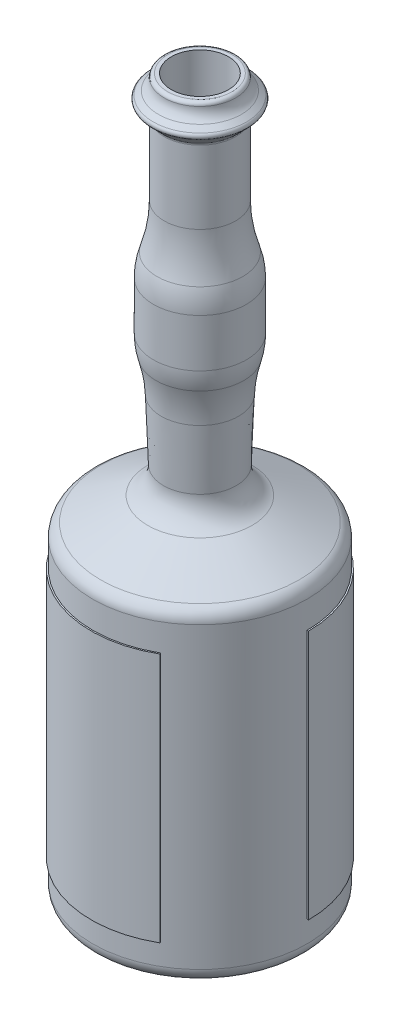
ISO-10303-21;
HEADER;
FILE_DESCRIPTION(('STEP AP214'),'2;1');
FILE_NAME('part.step','',(''),(''),'','','');
FILE_SCHEMA(('AUTOMOTIVE_DESIGN { 1 0 10303 214 1 1 1 1 }'));
ENDSEC;
DATA;
#1=APPLICATION_CONTEXT('core data for automotive mechanical design processes');
#2=APPLICATION_PROTOCOL_DEFINITION('international standard','automotive_design',2000,#1);
#3=PRODUCT_CONTEXT('',#1,'mechanical');
#4=PRODUCT('Part','Part','',(#3));
#5=PRODUCT_RELATED_PRODUCT_CATEGORY('part','',(#4));
#6=PRODUCT_DEFINITION_FORMATION('','',#4);
#7=PRODUCT_DEFINITION_CONTEXT('part definition',#1,'design');
#8=PRODUCT_DEFINITION('design','',#6,#7);
#9=PRODUCT_DEFINITION_SHAPE('','',#8);
#10=(LENGTH_UNIT() NAMED_UNIT(*) SI_UNIT(.MILLI.,.METRE.));
#11=(NAMED_UNIT(*) PLANE_ANGLE_UNIT() SI_UNIT($,.RADIAN.));
#12=(NAMED_UNIT(*) SI_UNIT($,.STERADIAN.) SOLID_ANGLE_UNIT());
#13=UNCERTAINTY_MEASURE_WITH_UNIT(LENGTH_MEASURE(1.E-05),#10,'distance_accuracy_value','');
#14=(GEOMETRIC_REPRESENTATION_CONTEXT(3) GLOBAL_UNCERTAINTY_ASSIGNED_CONTEXT((#13)) GLOBAL_UNIT_ASSIGNED_CONTEXT((#10,
#11,#12)) REPRESENTATION_CONTEXT('',''));
#15=CARTESIAN_POINT('',(0.,0.,0.));
#16=DIRECTION('',(0.,0.,1.));
#17=DIRECTION('',(1.,0.,0.));
#18=AXIS2_PLACEMENT_3D('',#15,#16,#17);
#19=CARTESIAN_POINT('',(0.,0.,0.));
#20=DIRECTION('',(0.,0.,1.));
#21=DIRECTION('',(1.,0.,0.));
#22=AXIS2_PLACEMENT_3D('',#19,#20,#21);
#23=PLANE('',#22);
#24=DIRECTION('',(1.,0.,0.));
#25=VECTOR('',#24,1.);
#26=CARTESIAN_POINT('',(0.,40.,0.));
#27=LINE('',#26,#25);
#28=CARTESIAN_POINT('',(15.,40.,0.));
#29=VERTEX_POINT('',#28);
#30=CARTESIAN_POINT('',(15.2,40.,0.));
#31=VERTEX_POINT('',#30);
#32=EDGE_CURVE('E122',#29,#31,#27,.T.);
#33=ORIENTED_EDGE('',*,*,#32,.F.);
#34=DIRECTION('',(0.,1.,0.));
#35=VECTOR('',#34,1.);
#36=CARTESIAN_POINT('',(15.,0.,0.));
#37=LINE('',#36,#35);
#38=CARTESIAN_POINT('',(15.,5.,0.));
#39=VERTEX_POINT('',#38);
#40=EDGE_CURVE('E132',#39,#29,#37,.T.);
#41=ORIENTED_EDGE('',*,*,#40,.F.);
#42=DIRECTION('',(-1.,0.,0.));
#43=VECTOR('',#42,1.);
#44=CARTESIAN_POINT('',(0.,4.99999999999993,0.));
#45=LINE('',#44,#43);
#46=CARTESIAN_POINT('',(15.2,5.,0.));
#47=VERTEX_POINT('',#46);
#48=EDGE_CURVE('E136',#47,#39,#45,.T.);
#49=ORIENTED_EDGE('',*,*,#48,.F.);
#50=DIRECTION('',(0.,-1.,0.));
#51=VECTOR('',#50,1.);
#52=CARTESIAN_POINT('',(15.2,0.,0.));
#53=LINE('',#52,#51);
#54=EDGE_CURVE('E134',#31,#47,#53,.T.);
#55=ORIENTED_EDGE('',*,*,#54,.F.);
#56=EDGE_LOOP('',(#33,#41,#49,#55));
#57=FACE_BOUND('',#56,.T.);
#58=ADVANCED_FACE('F81',(#57),#23,.T.);
#59=CARTESIAN_POINT('',(0.,0.,0.));
#60=DIRECTION('',(0.,-1.,0.));
#61=DIRECTION('',(0.,0.,-1.));
#62=AXIS2_PLACEMENT_3D('',#59,#60,#61);
#63=CYLINDRICAL_SURFACE('',#62,15.);
#64=CARTESIAN_POINT('',(0.,5.,0.));
#65=DIRECTION('',(0.,-1.,0.));
#66=DIRECTION('',(0.,0.,-1.));
#67=AXIS2_PLACEMENT_3D('',#64,#65,#66);
#68=CIRCLE('',#67,15.);
#69=CARTESIAN_POINT('',(7.50000000000015,5.,12.9903810567665));
#70=VERTEX_POINT('',#69);
#71=EDGE_CURVE('E89',#70,#39,#68,.T.);
#72=ORIENTED_EDGE('',*,*,#71,.T.);
#73=ORIENTED_EDGE('',*,*,#40,.T.);
#74=CARTESIAN_POINT('',(0.,40.,0.));
#75=DIRECTION('',(0.,-1.,0.));
#76=DIRECTION('',(0.,0.,-1.));
#77=AXIS2_PLACEMENT_3D('',#74,#75,#76);
#78=CIRCLE('',#77,15.);
#79=CARTESIAN_POINT('',(7.50000000000015,40.,12.9903810567665));
#80=VERTEX_POINT('',#79);
#81=EDGE_CURVE('E13',#80,#29,#78,.T.);
#82=ORIENTED_EDGE('',*,*,#81,.F.);
#83=DIRECTION('',(0.,1.,0.));
#84=VECTOR('',#83,1.);
#85=CARTESIAN_POINT('',(7.50000000000015,0.,12.9903810567665));
#86=LINE('',#85,#84);
#87=EDGE_CURVE('E142',#70,#80,#86,.T.);
#88=ORIENTED_EDGE('',*,*,#87,.F.);
#89=EDGE_LOOP('',(#72,#73,#82,#88));
#90=FACE_BOUND('',#89,.T.);
#91=ADVANCED_FACE('F83',(#90),#63,.F.);
#92=CARTESIAN_POINT('',(0.,5.,0.));
#93=DIRECTION('',(0.,1.,0.));
#94=DIRECTION('',(0.,0.,1.));
#95=AXIS2_PLACEMENT_3D('',#92,#93,#94);
#96=PLANE('',#95);
#97=CARTESIAN_POINT('',(0.,5.,0.));
#98=DIRECTION('',(0.,-1.,0.));
#99=DIRECTION('',(0.,0.,-1.));
#100=AXIS2_PLACEMENT_3D('',#97,#98,#99);
#101=CIRCLE('',#100,15.2);
#102=CARTESIAN_POINT('',(7.60000000000016,5.,13.1635861375234));
#103=VERTEX_POINT('',#102);
#104=EDGE_CURVE('E104',#103,#47,#101,.T.);
#105=ORIENTED_EDGE('',*,*,#104,.T.);
#106=ORIENTED_EDGE('',*,*,#48,.T.);
#107=ORIENTED_EDGE('',*,*,#71,.F.);
#108=DIRECTION('',(-0.50000000000001,0.,-0.866025403784433));
#109=VECTOR('',#108,1.);
#110=CARTESIAN_POINT('',(0.,4.99999999999993,0.));
#111=LINE('',#110,#109);
#112=EDGE_CURVE('E144',#103,#70,#111,.T.);
#113=ORIENTED_EDGE('',*,*,#112,.F.);
#114=EDGE_LOOP('',(#105,#106,#107,#113));
#115=FACE_BOUND('',#114,.T.);
#116=ADVANCED_FACE('F152',(#115),#96,.F.);
#117=CARTESIAN_POINT('',(0.,0.,0.));
#118=DIRECTION('',(0.,-1.,0.));
#119=DIRECTION('',(0.,0.,-1.));
#120=AXIS2_PLACEMENT_3D('',#117,#118,#119);
#121=CYLINDRICAL_SURFACE('',#120,15.2);
#122=DIRECTION('',(0.,-1.,0.));
#123=VECTOR('',#122,1.);
#124=CARTESIAN_POINT('',(7.60000000000016,0.,13.1635861375234));
#125=LINE('',#124,#123);
#126=CARTESIAN_POINT('',(7.60000000000015,40.,13.1635861375234));
#127=VERTEX_POINT('',#126);
#128=EDGE_CURVE('E147',#127,#103,#125,.T.);
#129=ORIENTED_EDGE('',*,*,#128,.F.);
#130=CARTESIAN_POINT('',(0.,40.,0.));
#131=DIRECTION('',(0.,-1.,0.));
#132=DIRECTION('',(0.,0.,-1.));
#133=AXIS2_PLACEMENT_3D('',#130,#131,#132);
#134=CIRCLE('',#133,15.2);
#135=EDGE_CURVE('E96',#127,#31,#134,.T.);
#136=ORIENTED_EDGE('',*,*,#135,.T.);
#137=ORIENTED_EDGE('',*,*,#54,.T.);
#138=ORIENTED_EDGE('',*,*,#104,.F.);
#139=EDGE_LOOP('',(#129,#136,#137,#138));
#140=FACE_BOUND('',#139,.T.);
#141=ADVANCED_FACE('F153',(#140),#121,.T.);
#142=CARTESIAN_POINT('',(0.,40.,0.));
#143=DIRECTION('',(0.,-1.,0.));
#144=DIRECTION('',(0.,0.,-1.));
#145=AXIS2_PLACEMENT_3D('',#142,#143,#144);
#146=PLANE('',#145);
#147=ORIENTED_EDGE('',*,*,#81,.T.);
#148=ORIENTED_EDGE('',*,*,#32,.T.);
#149=ORIENTED_EDGE('',*,*,#135,.F.);
#150=DIRECTION('',(0.50000000000001,0.,0.866025403784433));
#151=VECTOR('',#150,1.);
#152=CARTESIAN_POINT('',(0.,40.,0.));
#153=LINE('',#152,#151);
#154=EDGE_CURVE('E124',#80,#127,#153,.T.);
#155=ORIENTED_EDGE('',*,*,#154,.F.);
#156=EDGE_LOOP('',(#147,#148,#149,#155));
#157=FACE_BOUND('',#156,.T.);
#158=ADVANCED_FACE('F121',(#157),#146,.F.);
#159=CARTESIAN_POINT('',(0.,0.,0.));
#160=DIRECTION('',(-0.866025403784433,0.,0.50000000000001));
#161=DIRECTION('',(0.50000000000001,0.,0.866025403784433));
#162=AXIS2_PLACEMENT_3D('',#159,#160,#161);
#163=PLANE('',#162);
#164=ORIENTED_EDGE('',*,*,#154,.T.);
#165=ORIENTED_EDGE('',*,*,#128,.T.);
#166=ORIENTED_EDGE('',*,*,#112,.T.);
#167=ORIENTED_EDGE('',*,*,#87,.T.);
#168=EDGE_LOOP('',(#164,#165,#166,#167));
#169=FACE_BOUND('',#168,.T.);
#170=ADVANCED_FACE('F155',(#169),#163,.F.);
#171=CLOSED_SHELL('',(#58,#91,#116,#141,#158,#170));
#172=MANIFOLD_SOLID_BREP('B2',#171);
#173=CARTESIAN_POINT('',(0.,0.,0.));
#174=DIRECTION('',(0.,1.,0.));
#175=DIRECTION('',(0.,0.,1.));
#176=AXIS2_PLACEMENT_3D('',#173,#174,#175);
#177=PLANE('',#176);
#178=CARTESIAN_POINT('',(0.,0.,0.));
#179=DIRECTION('',(0.,1.,0.));
#180=DIRECTION('',(0.,0.,1.));
#181=AXIS2_PLACEMENT_3D('',#178,#179,#180);
#182=CIRCLE('',#181,13.);
#183=CARTESIAN_POINT('',(0.,0.,13.));
#184=VERTEX_POINT('',#183);
#185=EDGE_CURVE('E376',#184,#184,#182,.F.);
#186=ORIENTED_EDGE('',*,*,#185,.T.);
#187=EDGE_LOOP('',(#186));
#188=FACE_BOUND('',#187,.T.);
#189=ADVANCED_FACE('F247',(#188),#177,.F.);
#190=CARTESIAN_POINT('',(0.,0.,0.));
#191=DIRECTION('',(0.,1.,0.));
#192=DIRECTION('',(0.,0.,1.));
#193=AXIS2_PLACEMENT_3D('',#190,#191,#192);
#194=CYLINDRICAL_SURFACE('',#193,15.);
#195=CARTESIAN_POINT('',(0.,43.7639320225002,0.));
#196=DIRECTION('',(0.,-1.,0.));
#197=DIRECTION('',(0.,0.,-1.));
#198=AXIS2_PLACEMENT_3D('',#195,#196,#197);
#199=CIRCLE('',#198,15.);
#200=CARTESIAN_POINT('',(0.,43.7639320225002,-15.));
#201=VERTEX_POINT('',#200);
#202=EDGE_CURVE('E380',#201,#201,#199,.T.);
#203=ORIENTED_EDGE('',*,*,#202,.T.);
#204=EDGE_LOOP('',(#203));
#205=FACE_BOUND('',#204,.T.);
#206=CARTESIAN_POINT('',(0.,2.,0.));
#207=DIRECTION('',(0.,1.,0.));
#208=DIRECTION('',(0.,0.,1.));
#209=AXIS2_PLACEMENT_3D('',#206,#207,#208);
#210=CIRCLE('',#209,15.);
#211=CARTESIAN_POINT('',(0.,2.,15.));
#212=VERTEX_POINT('',#211);
#213=EDGE_CURVE('E415',#212,#212,#210,.T.);
#214=ORIENTED_EDGE('',*,*,#213,.T.);
#215=EDGE_LOOP('',(#214));
#216=FACE_BOUND('',#215,.T.);
#217=ADVANCED_FACE('F337',(#205,#216),#194,.T.);
#218=CARTESIAN_POINT('',(0.,50.,0.));
#219=DIRECTION('',(0.,-1.,0.));
#220=DIRECTION('',(0.,0.,-1.));
#221=AXIS2_PLACEMENT_3D('',#218,#219,#220);
#222=CONICAL_SURFACE('',#221,5.,1.10714871779409);
#223=CARTESIAN_POINT('',(0.,48.8498036512811,0.));
#224=DIRECTION('',(0.,-1.,0.));
#225=DIRECTION('',(0.,0.,-1.));
#226=AXIS2_PLACEMENT_3D('',#223,#224,#225);
#227=CIRCLE('',#226,7.30039269743788);
#228=CARTESIAN_POINT('',(0.,48.8498036512811,-7.30039269743788));
#229=VERTEX_POINT('',#228);
#230=EDGE_CURVE('E371',#229,#229,#227,.T.);
#231=ORIENTED_EDGE('',*,*,#230,.T.);
#232=EDGE_LOOP('',(#231));
#233=FACE_BOUND('',#232,.T.);
#234=CARTESIAN_POINT('',(0.,45.5527864045,0.));
#235=DIRECTION('',(0.,1.,0.));
#236=DIRECTION('',(0.,0.,1.));
#237=AXIS2_PLACEMENT_3D('',#234,#235,#236);
#238=CIRCLE('',#237,13.8944271909999);
#239=CARTESIAN_POINT('',(0.,45.5527864045,13.8944271909999));
#240=VERTEX_POINT('',#239);
#241=EDGE_CURVE('E413',#240,#240,#238,.T.);
#242=ORIENTED_EDGE('',*,*,#241,.T.);
#243=EDGE_LOOP('',(#242));
#244=FACE_BOUND('',#243,.T.);
#245=ADVANCED_FACE('F343',(#233,#244),#222,.T.);
#246=CARTESIAN_POINT('',(0.,50.,0.));
#247=DIRECTION('',(0.,1.,0.));
#248=DIRECTION('',(0.,0.,1.));
#249=AXIS2_PLACEMENT_3D('',#246,#247,#248);
#250=CONICAL_SURFACE('',#249,5.,0.0356991126793239);
#251=CARTESIAN_POINT('',(0.,61.1216545078617,0.));
#252=DIRECTION('',(0.,1.,0.));
#253=DIRECTION('',(0.,0.,1.));
#254=AXIS2_PLACEMENT_3D('',#251,#252,#253);
#255=CIRCLE('',#254,5.39720194670935);
#256=CARTESIAN_POINT('',(0.,61.1216545078617,5.39720194670935));
#257=VERTEX_POINT('',#256);
#258=EDGE_CURVE('E378',#257,#257,#255,.F.);
#259=ORIENTED_EDGE('',*,*,#258,.T.);
#260=EDGE_LOOP('',(#259));
#261=FACE_BOUND('',#260,.T.);
#262=CARTESIAN_POINT('',(0.,52.5702785373304,0.));
#263=DIRECTION('',(0.,1.,0.));
#264=DIRECTION('',(0.,0.,1.));
#265=AXIS2_PLACEMENT_3D('',#262,#263,#264);
#266=CIRCLE('',#265,5.09179566204751);
#267=CARTESIAN_POINT('',(0.,52.5702785373304,5.09179566204751));
#268=VERTEX_POINT('',#267);
#269=EDGE_CURVE('E374',#268,#268,#266,.T.);
#270=ORIENTED_EDGE('',*,*,#269,.T.);
#271=EDGE_LOOP('',(#270));
#272=FACE_BOUND('',#271,.T.);
#273=ADVANCED_FACE('F354',(#261,#272),#250,.T.);
#274=CARTESIAN_POINT('',(0.,43.7639320225002,0.));
#275=DIRECTION('',(0.,-1.,0.));
#276=DIRECTION('',(0.,0.,-1.));
#277=AXIS2_PLACEMENT_3D('',#274,#275,#276);
#278=TOROIDAL_SURFACE('',#277,13.,2.);
#279=ORIENTED_EDGE('',*,*,#202,.F.);
#280=EDGE_LOOP('',(#279));
#281=FACE_BOUND('',#280,.T.);
#282=ORIENTED_EDGE('',*,*,#241,.F.);
#283=EDGE_LOOP('',(#282));
#284=FACE_BOUND('',#283,.T.);
#285=ADVANCED_FACE('F350',(#281,#284),#278,.T.);
#286=CARTESIAN_POINT('',(0.,2.,0.));
#287=DIRECTION('',(0.,1.,0.));
#288=DIRECTION('',(0.,0.,1.));
#289=AXIS2_PLACEMENT_3D('',#286,#287,#288);
#290=TOROIDAL_SURFACE('',#289,13.,2.);
#291=ORIENTED_EDGE('',*,*,#185,.F.);
#292=EDGE_LOOP('',(#291));
#293=FACE_BOUND('',#292,.T.);
#294=ORIENTED_EDGE('',*,*,#213,.F.);
#295=EDGE_LOOP('',(#294));
#296=FACE_BOUND('',#295,.T.);
#297=ADVANCED_FACE('F353',(#293,#296),#290,.T.);
#298=CARTESIAN_POINT('',(0.,67.,0.));
#299=DIRECTION('',(0.,1.,0.));
#300=DIRECTION('',(0.,0.,1.));
#301=AXIS2_PLACEMENT_3D('',#298,#299,#300);
#302=CYLINDRICAL_SURFACE('',#301,6.5);
#303=CARTESIAN_POINT('',(0.,68.5126389067792,0.));
#304=DIRECTION('',(0.,-1.,0.));
#305=DIRECTION('',(0.,0.,-1.));
#306=AXIS2_PLACEMENT_3D('',#303,#304,#305);
#307=CIRCLE('',#306,6.5);
#308=CARTESIAN_POINT('',(0.,68.5126389067792,-6.5));
#309=VERTEX_POINT('',#308);
#310=EDGE_CURVE('E254',#309,#309,#307,.F.);
#311=ORIENTED_EDGE('',*,*,#310,.T.);
#312=EDGE_LOOP('',(#311));
#313=FACE_BOUND('',#312,.T.);
#314=CARTESIAN_POINT('',(0.,75.2318450791878,0.));
#315=DIRECTION('',(0.,-1.,0.));
#316=DIRECTION('',(0.,0.,-1.));
#317=AXIS2_PLACEMENT_3D('',#314,#315,#316);
#318=CIRCLE('',#317,6.5);
#319=CARTESIAN_POINT('',(0.,75.2318450791878,-6.5));
#320=VERTEX_POINT('',#319);
#321=EDGE_CURVE('E282',#320,#320,#318,.T.);
#322=ORIENTED_EDGE('',*,*,#321,.T.);
#323=EDGE_LOOP('',(#322));
#324=FACE_BOUND('',#323,.T.);
#325=ADVANCED_FACE('F357',(#313,#324),#302,.T.);
#326=CARTESIAN_POINT('',(0.,52.4275124152807,0.));
#327=DIRECTION('',(0.,1.,0.));
#328=DIRECTION('',(0.,0.,1.));
#329=AXIS2_PLACEMENT_3D('',#326,#327,#328);
#330=TOROIDAL_SURFACE('',#329,9.08924707943771,4.);
#331=ORIENTED_EDGE('',*,*,#230,.F.);
#332=EDGE_LOOP('',(#331));
#333=FACE_BOUND('',#332,.T.);
#334=ORIENTED_EDGE('',*,*,#269,.F.);
#335=EDGE_LOOP('',(#334));
#336=FACE_BOUND('',#335,.T.);
#337=ADVANCED_FACE('F359',(#333,#336),#330,.F.);
#338=CARTESIAN_POINT('',(0.,60.4078238976134,0.));
#339=DIRECTION('',(0.,1.,0.));
#340=DIRECTION('',(0.,0.,1.));
#341=AXIS2_PLACEMENT_3D('',#338,#339,#340);
#342=TOROIDAL_SURFACE('',#341,25.3844590336603,20.);
#343=CARTESIAN_POINT('',(0.,65.8110339037239,0.));
#344=DIRECTION('',(0.,-1.,0.));
#345=DIRECTION('',(0.,0.,-1.));
#346=AXIS2_PLACEMENT_3D('',#343,#344,#345);
#347=CIRCLE('',#346,6.12815301122012);
#348=CARTESIAN_POINT('',(0.,65.8110339037239,-6.12815301122012));
#349=VERTEX_POINT('',#348);
#350=EDGE_CURVE('E80',#349,#349,#347,.T.);
#351=ORIENTED_EDGE('',*,*,#350,.T.);
#352=EDGE_LOOP('',(#351));
#353=FACE_BOUND('',#352,.T.);
#354=ORIENTED_EDGE('',*,*,#258,.F.);
#355=EDGE_LOOP('',(#354));
#356=FACE_BOUND('',#355,.T.);
#357=ADVANCED_FACE('F308',(#353,#356),#342,.F.);
#358=CARTESIAN_POINT('',(0.,80.,0.));
#359=DIRECTION('',(0.,1.,0.));
#360=DIRECTION('',(0.,0.,1.));
#361=AXIS2_PLACEMENT_3D('',#358,#359,#360);
#362=CYLINDRICAL_SURFACE('',#361,5.);
#363=CARTESIAN_POINT('',(0.,94.8044922111821,0.));
#364=DIRECTION('',(0.,1.,0.));
#365=DIRECTION('',(0.,0.,1.));
#366=AXIS2_PLACEMENT_3D('',#363,#364,#365);
#367=CIRCLE('',#366,5.);
#368=CARTESIAN_POINT('',(0.,94.8044922111821,5.));
#369=VERTEX_POINT('',#368);
#370=EDGE_CURVE('E262',#369,#369,#367,.F.);
#371=ORIENTED_EDGE('',*,*,#370,.T.);
#372=EDGE_LOOP('',(#371));
#373=FACE_BOUND('',#372,.T.);
#374=CARTESIAN_POINT('',(0.,84.5993420767853,0.));
#375=DIRECTION('',(0.,1.,0.));
#376=DIRECTION('',(0.,0.,1.));
#377=AXIS2_PLACEMENT_3D('',#374,#375,#376);
#378=CIRCLE('',#377,5.);
#379=CARTESIAN_POINT('',(0.,84.5993420767853,5.));
#380=VERTEX_POINT('',#379);
#381=EDGE_CURVE('E288',#380,#380,#378,.T.);
#382=ORIENTED_EDGE('',*,*,#381,.T.);
#383=EDGE_LOOP('',(#382));
#384=FACE_BOUND('',#383,.T.);
#385=ADVANCED_FACE('F306',(#373,#384),#362,.T.);
#386=CARTESIAN_POINT('',(0.,84.5993420767853,0.));
#387=DIRECTION('',(0.,-1.,0.));
#388=DIRECTION('',(0.,0.,-1.));
#389=AXIS2_PLACEMENT_3D('',#386,#387,#388);
#390=TOROIDAL_SURFACE('',#389,25.,20.);
#391=CARTESIAN_POINT('',(0.,78.354344078387,0.));
#392=DIRECTION('',(0.,1.,0.));
#393=DIRECTION('',(0.,0.,1.));
#394=AXIS2_PLACEMENT_3D('',#391,#392,#393);
#395=CIRCLE('',#394,6.);
#396=CARTESIAN_POINT('',(0.,78.354344078387,6.));
#397=VERTEX_POINT('',#396);
#398=EDGE_CURVE('E285',#397,#397,#395,.T.);
#399=ORIENTED_EDGE('',*,*,#398,.T.);
#400=EDGE_LOOP('',(#399));
#401=FACE_BOUND('',#400,.T.);
#402=ORIENTED_EDGE('',*,*,#381,.F.);
#403=EDGE_LOOP('',(#402));
#404=FACE_BOUND('',#403,.T.);
#405=ADVANCED_FACE('F295',(#401,#404),#390,.F.);
#406=CARTESIAN_POINT('',(0.,75.2318450791878,0.));
#407=DIRECTION('',(0.,-1.,0.));
#408=DIRECTION('',(0.,0.,-1.));
#409=AXIS2_PLACEMENT_3D('',#406,#407,#408);
#410=DEGENERATE_TOROIDAL_SURFACE('',#409,3.5,10.,.F.);
#411=ORIENTED_EDGE('',*,*,#321,.F.);
#412=EDGE_LOOP('',(#411));
#413=FACE_BOUND('',#412,.T.);
#414=ORIENTED_EDGE('',*,*,#398,.F.);
#415=EDGE_LOOP('',(#414));
#416=FACE_BOUND('',#415,.T.);
#417=ADVANCED_FACE('F305',(#413,#416),#410,.F.);
#418=CARTESIAN_POINT('',(6.95787828317773,97.,-0.766765802891455));
#419=CARTESIAN_POINT('',(4.96911137244617,95.,0.554916361469131));
#420=CARTESIAN_POINT('',(8.49140988896064,97.,13.148990763464));
#421=CARTESIAN_POINT('',(3.85927864950791,95.,10.4931391063615));
#422=CARTESIAN_POINT('',(-5.42434667739482,97.,14.6825223692469));
#423=CARTESIAN_POINT('',(-6.07894409538443,95.,9.38330638342321));
#424=CARTESIAN_POINT('',(-6.95787828317773,97.,0.766765802891455));
#425=CARTESIAN_POINT('',(-4.96911137244617,95.,-0.554916361469132));
#426=CARTESIAN_POINT('',(-8.49140988896064,97.,-13.148990763464));
#427=CARTESIAN_POINT('',(-3.85927864950791,95.,-10.4931391063615));
#428=CARTESIAN_POINT('',(5.42434667739482,97.,-14.6825223692469));
#429=CARTESIAN_POINT('',(6.07894409538443,95.,-9.38330638342321));
#430=CARTESIAN_POINT('',(6.95787828317773,97.,-0.766765802891455));
#431=CARTESIAN_POINT('',(4.96911137244617,95.,0.554916361469131));
#432=(BOUNDED_SURFACE() B_SPLINE_SURFACE(3,1,((#418,#419),(#420,#421),(#422,#423),(#424,#425),
(#426,#427),(#428,#429),(#430,#431)),.UNSPECIFIED.,.T.,.F.,.F.) B_SPLINE_SURFACE_WITH_KNOTS((4,
3,4),(2,2),(0.,0.5,1.),(0.,1.),
.UNSPECIFIED.) GEOMETRIC_REPRESENTATION_ITEM() RATIONAL_B_SPLINE_SURFACE(((1.,1.),
(0.333333333333333,0.333333333333333),(0.333333333333333,0.333333333333333),(1.,1.),
(0.333333333333333,0.333333333333333),(0.333333333333333,0.333333333333333),(1.,1.))) REPRESENTATION_ITEM('') SURFACE());
#433=CARTESIAN_POINT('',(0.,96.5941117168195,0.));
#434=DIRECTION('',(0.,-1.,0.));
#435=DIRECTION('',(0.,0.,-1.));
#436=AXIS2_PLACEMENT_3D('',#433,#434,#435);
#437=CIRCLE('',#436,6.57320252634436);
#438=CARTESIAN_POINT('',(6.55426968965621,96.5941117168195,-0.498538150590147));
#439=VERTEX_POINT('',#438);
#440=EDGE_CURVE('E267',#439,#439,#437,.T.);
#441=CARTESIAN_POINT('',(0.,95.1452598366395,0.));
#442=DIRECTION('',(0.,-1.,0.));
#443=DIRECTION('',(0.,0.,-1.));
#444=AXIS2_PLACEMENT_3D('',#441,#442,#443);
#445=CIRCLE('',#444,5.13410735804045);
#446=CARTESIAN_POINT('',(5.11355535072966,95.1452598366395,0.458922693826928));
#447=VERTEX_POINT('',#446);
#448=EDGE_CURVE('E270',#447,#447,#445,.F.);
#449=CARTESIAN_POINT('',(6.55426968965621,96.5941117168195,-0.498538150590147));
#450=CARTESIAN_POINT('',(6.53926224862572,96.5790195097343,-0.488564600127468));
#451=CARTESIAN_POINT('',(6.52425480759524,96.5639273026491,-0.478591049664791));
#452=CARTESIAN_POINT('',(6.49423992553427,96.5337428884787,-0.458643948739436));
#453=CARTESIAN_POINT('',(6.47923248450379,96.5186506813935,-0.448670398276759));
#454=CARTESIAN_POINT('',(6.44921760244282,96.488466267223,-0.428723297351402));
#455=CARTESIAN_POINT('',(6.43421016141233,96.4733740601378,-0.418749746888723));
#456=CARTESIAN_POINT('',(6.40419527935136,96.4431896459674,-0.398802645963367));
#457=CARTESIAN_POINT('',(6.38918783832088,96.4280974388822,-0.388829095500691));
#458=CARTESIAN_POINT('',(6.35917295625991,96.3979130247118,-0.368881994575336));
#459=CARTESIAN_POINT('',(6.34416551522942,96.3828208176266,-0.358908444112658));
#460=CARTESIAN_POINT('',(6.31415063316845,96.3526364034562,-0.338961343187301));
#461=CARTESIAN_POINT('',(6.29914319213797,96.337544196371,-0.328987792724623));
#462=CARTESIAN_POINT('',(6.269128310077,96.3073597822005,-0.309040691799267));
#463=CARTESIAN_POINT('',(6.25412086904651,96.2922675751153,-0.29906714133659));
#464=CARTESIAN_POINT('',(6.22410598698554,96.2620831609449,-0.279120040411235));
#465=CARTESIAN_POINT('',(6.20909854595506,96.2469909538597,-0.269146489948556));
#466=CARTESIAN_POINT('',(6.17908366389409,96.2168065396893,-0.2491993890232));
#467=CARTESIAN_POINT('',(6.1640762228636,96.2017143326041,-0.239225838560522));
#468=CARTESIAN_POINT('',(6.13406134080263,96.1715299184337,-0.219278737635168));
#469=CARTESIAN_POINT('',(6.11905389977215,96.1564377113485,-0.20930518717249));
#470=CARTESIAN_POINT('',(6.08903901771118,96.1262532971781,-0.189358086247133));
#471=CARTESIAN_POINT('',(6.07403157668069,96.1111610900928,-0.179384535784454));
#472=CARTESIAN_POINT('',(6.04401669461972,96.0809766759224,-0.159437434859099));
#473=CARTESIAN_POINT('',(6.02900925358924,96.0658844688372,-0.149463884396423));
#474=CARTESIAN_POINT('',(5.99899437152827,96.0357000546668,-0.129516783471067));
#475=CARTESIAN_POINT('',(5.98398693049778,96.0206078475816,-0.119543233008387));
#476=CARTESIAN_POINT('',(5.95397204843681,95.9904234334112,-0.0995961320830312));
#477=CARTESIAN_POINT('',(5.93896460740633,95.975331226326,-0.0896225816203554));
#478=CARTESIAN_POINT('',(5.90894972534536,95.9451468121555,-0.0696754806950009));
#479=CARTESIAN_POINT('',(5.89394228431488,95.9300546050703,-0.0597019302323221));
#480=CARTESIAN_POINT('',(5.8639274022539,95.8998701908999,-0.0397548293069646));
#481=CARTESIAN_POINT('',(5.84891996122342,95.8847779838147,-0.0297812788442858));
#482=CARTESIAN_POINT('',(5.81890507916245,95.8545935696443,-0.00983417791893101));
#483=CARTESIAN_POINT('',(5.80389763813197,95.8395013625591,0.000139372543744924));
#484=CARTESIAN_POINT('',(5.773882756071,95.8093169483887,0.0200864734691004));
#485=CARTESIAN_POINT('',(5.75887531504051,95.7942247413035,0.0300600239317798));
#486=CARTESIAN_POINT('',(5.72886043297954,95.7640403271331,0.0500071248571365));
#487=CARTESIAN_POINT('',(5.71385299194906,95.7489481200478,0.0599806753198136));
#488=CARTESIAN_POINT('',(5.68383810988809,95.7187637058774,0.0799277762451688));
#489=CARTESIAN_POINT('',(5.6688306688576,95.7036714987922,0.0899013267078468));
#490=CARTESIAN_POINT('',(5.63881578679663,95.6734870846218,0.109848427633203));
#491=CARTESIAN_POINT('',(5.62380834576615,95.6583948775366,0.119821978095881));
#492=CARTESIAN_POINT('',(5.59379346370518,95.6282104633662,0.139769079021236));
#493=CARTESIAN_POINT('',(5.57878602267469,95.613118256281,0.149742629483913));
#494=CARTESIAN_POINT('',(5.54877114061372,95.5829338421106,0.169689730409269));
#495=CARTESIAN_POINT('',(5.53376369958324,95.5678416350253,0.179663280871948));
#496=CARTESIAN_POINT('',(5.50374881752227,95.5376572208549,0.199610381797304));
#497=CARTESIAN_POINT('',(5.48874137649178,95.5225650137697,0.209583932259981));
#498=CARTESIAN_POINT('',(5.45872649443081,95.4923805995993,0.229531033185336));
#499=CARTESIAN_POINT('',(5.44371905340033,95.4772883925141,0.239504583648015));
#500=CARTESIAN_POINT('',(5.41370417133936,95.4471039783437,0.259451684573371));
#501=CARTESIAN_POINT('',(5.39869673030887,95.4320117712585,0.269425235036049));
#502=CARTESIAN_POINT('',(5.3686818482479,95.4018273570881,0.289372335961404));
#503=CARTESIAN_POINT('',(5.35367440721742,95.3867351500029,0.299345886424082));
#504=CARTESIAN_POINT('',(5.32365952515645,95.3565507358324,0.319292987349438));
#505=CARTESIAN_POINT('',(5.30865208412597,95.3414585287472,0.329266537812115));
#506=CARTESIAN_POINT('',(5.278637202065,95.3112741145768,0.349213638737471));
#507=CARTESIAN_POINT('',(5.26362976103451,95.2961819074916,0.35918718920015));
#508=CARTESIAN_POINT('',(5.23361487897354,95.2659974933212,0.379134290125506));
#509=CARTESIAN_POINT('',(5.21860743794305,95.250905286236,0.389107840588183));
#510=CARTESIAN_POINT('',(5.18859255588209,95.2207208720656,0.409054941513538));
#511=CARTESIAN_POINT('',(5.1735851148516,95.2056286649804,0.419028491976216));
#512=CARTESIAN_POINT('',(5.14357023279063,95.17544425081,0.438975592901572));
#513=CARTESIAN_POINT('',(5.12856279176015,95.1603520437247,0.44894914336425));
#514=CARTESIAN_POINT('',(5.11355535072966,95.1452598366395,0.458922693826928));
#515=B_SPLINE_CURVE_WITH_KNOTS('',3,(#449,#450,#451,#452,#453,#454,#455,#456,#457,#458,#459,
#460,#461,#462,#463,#464,#465,#466,#467,#468,#469,#470,#471,#472,#473,#474,#475,#476,#477,#478,
#479,#480,#481,#482,#483,#484,#485,#486,#487,#488,#489,#490,#491,#492,#493,#494,#495,#496,#497,
#498,#499,#500,#501,#502,#503,#504,#505,#506,#507,#508,#509,#510,#511,#512,#513,#514),
.UNSPECIFIED.,.F.,.F.,(4,2,2,2,2,2,2,2,2,2,2,2,2,2,2,2,2,2,2,2,2,2,2,2,2,2,2,2,2,2,2,2,4),(0.,
0.0705140226363602,0.14102804527272,0.211542067909071,0.28205609054544,0.3525701131818,
0.423084135818151,0.493598158454511,0.564112181090861,0.634626203727221,0.705140226363581,
0.775654248999932,0.846168271636301,0.916682294272653,0.987196316909021,1.05771033954537,
1.12822436218172,1.19873838481809,1.26925240745444,1.3397664300908,1.41028045272716,
1.48079447536352,1.55130849799988,1.62182252063623,1.69233654327259,1.76285056590894,
1.8333645885453,1.90387861118166,1.97439263381802,2.04490665645438,2.11542067909074,
2.1859347017271,2.25644872436345),.UNSPECIFIED.);
#516=EDGE_CURVE('BSEAM312',#439,#447,#515,.T.);
#517=ORIENTED_EDGE('',*,*,#440,.T.);
#518=ORIENTED_EDGE('',*,*,#448,.T.);
#519=ORIENTED_EDGE('',*,*,#516,.T.);
#520=ORIENTED_EDGE('',*,*,#516,.F.);
#521=EDGE_LOOP('',(#517,#519,#518,#520));
#522=FACE_BOUND('',#521,.T.);
#523=ADVANCED_FACE('F312',(#522),#432,.T.);
#524=CARTESIAN_POINT('',(0.,98.5,0.));
#525=DIRECTION('',(0.,-1.,0.));
#526=DIRECTION('',(0.,0.,-1.));
#527=AXIS2_PLACEMENT_3D('',#524,#525,#526);
#528=CONICAL_SURFACE('',#527,5.,0.927295218001612);
#529=CARTESIAN_POINT('',(0.,97.9,0.));
#530=DIRECTION('',(0.,-1.,0.));
#531=DIRECTION('',(0.,0.,-1.));
#532=AXIS2_PLACEMENT_3D('',#529,#530,#531);
#533=CIRCLE('',#532,5.8);
#534=CARTESIAN_POINT('',(0.,97.9,-5.8));
#535=VERTEX_POINT('',#534);
#536=EDGE_CURVE('E258',#535,#535,#533,.T.);
#537=ORIENTED_EDGE('',*,*,#536,.T.);
#538=EDGE_LOOP('',(#537));
#539=FACE_BOUND('',#538,.T.);
#540=CARTESIAN_POINT('',(0.,97.3548009778594,0.));
#541=DIRECTION('',(0.,1.,0.));
#542=DIRECTION('',(0.,0.,1.));
#543=AXIS2_PLACEMENT_3D('',#540,#541,#542);
#544=CIRCLE('',#543,6.52693202952076);
#545=CARTESIAN_POINT('',(0.,97.3548009778594,6.52693202952076));
#546=VERTEX_POINT('',#545);
#547=EDGE_CURVE('E273',#546,#546,#544,.T.);
#548=ORIENTED_EDGE('',*,*,#547,.T.);
#549=EDGE_LOOP('',(#548));
#550=FACE_BOUND('',#549,.T.);
#551=ADVANCED_FACE('F555',(#539,#550),#528,.T.);
#552=CARTESIAN_POINT('',(0.,100.,0.));
#553=DIRECTION('',(0.,1.,0.));
#554=DIRECTION('',(0.,0.,1.));
#555=AXIS2_PLACEMENT_3D('',#552,#553,#554);
#556=PLANE('',#555);
#557=CARTESIAN_POINT('',(0.,100.,0.));
#558=DIRECTION('',(0.,1.,0.));
#559=DIRECTION('',(0.,0.,1.));
#560=AXIS2_PLACEMENT_3D('',#557,#558,#559);
#561=CIRCLE('',#560,4.5);
#562=CARTESIAN_POINT('',(0.,100.,4.5));
#563=VERTEX_POINT('',#562);
#564=EDGE_CURVE('E279',#563,#563,#561,.T.);
#565=ORIENTED_EDGE('',*,*,#564,.T.);
#566=EDGE_LOOP('',(#565));
#567=FACE_BOUND('',#566,.T.);
#568=CARTESIAN_POINT('',(0.,100.,0.));
#569=DIRECTION('',(0.,1.,0.));
#570=DIRECTION('',(0.,0.,1.));
#571=AXIS2_PLACEMENT_3D('',#568,#569,#570);
#572=CIRCLE('',#571,4.);
#573=CARTESIAN_POINT('',(0.,100.,4.));
#574=VERTEX_POINT('',#573);
#575=EDGE_CURVE('E424',#574,#574,#572,.T.);
#576=ORIENTED_EDGE('',*,*,#575,.F.);
#577=EDGE_LOOP('',(#576));
#578=FACE_BOUND('',#577,.T.);
#579=ADVANCED_FACE('F400',(#567,#578),#556,.T.);
#580=CARTESIAN_POINT('',(0.,80.,0.));
#581=DIRECTION('',(0.,1.,0.));
#582=DIRECTION('',(0.,0.,1.));
#583=AXIS2_PLACEMENT_3D('',#580,#581,#582);
#584=CYLINDRICAL_SURFACE('',#583,4.);
#585=ORIENTED_EDGE('',*,*,#575,.T.);
#586=EDGE_LOOP('',(#585));
#587=FACE_BOUND('',#586,.T.);
#588=CARTESIAN_POINT('',(0.,84.5993420767853,0.));
#589=DIRECTION('',(0.,1.,0.));
#590=DIRECTION('',(0.,0.,1.));
#591=AXIS2_PLACEMENT_3D('',#588,#589,#590);
#592=CIRCLE('',#591,4.);
#593=CARTESIAN_POINT('',(0.,84.5993420767853,4.));
#594=VERTEX_POINT('',#593);
#595=EDGE_CURVE('E433',#594,#594,#592,.T.);
#596=ORIENTED_EDGE('',*,*,#595,.F.);
#597=EDGE_LOOP('',(#596));
#598=FACE_BOUND('',#597,.T.);
#599=ADVANCED_FACE('F470',(#587,#598),#584,.F.);
#600=CARTESIAN_POINT('',(0.,1.,0.));
#601=DIRECTION('',(0.,1.,0.));
#602=DIRECTION('',(0.,0.,1.));
#603=AXIS2_PLACEMENT_3D('',#600,#601,#602);
#604=PLANE('',#603);
#605=CARTESIAN_POINT('',(0.,1.,0.));
#606=DIRECTION('',(0.,1.,0.));
#607=DIRECTION('',(0.,0.,1.));
#608=AXIS2_PLACEMENT_3D('',#605,#606,#607);
#609=CIRCLE('',#608,13.);
#610=CARTESIAN_POINT('',(0.,1.,13.));
#611=VERTEX_POINT('',#610);
#612=EDGE_CURVE('E451',#611,#611,#609,.F.);
#613=ORIENTED_EDGE('',*,*,#612,.F.);
#614=EDGE_LOOP('',(#613));
#615=FACE_BOUND('',#614,.T.);
#616=ADVANCED_FACE('F468',(#615),#604,.T.);
#617=CARTESIAN_POINT('',(0.,2.,0.));
#618=DIRECTION('',(0.,1.,0.));
#619=DIRECTION('',(0.,0.,1.));
#620=AXIS2_PLACEMENT_3D('',#617,#618,#619);
#621=TOROIDAL_SURFACE('',#620,13.,1.);
#622=ORIENTED_EDGE('',*,*,#612,.T.);
#623=EDGE_LOOP('',(#622));
#624=FACE_BOUND('',#623,.T.);
#625=CARTESIAN_POINT('',(0.,2.,0.));
#626=DIRECTION('',(0.,1.,0.));
#627=DIRECTION('',(0.,0.,1.));
#628=AXIS2_PLACEMENT_3D('',#625,#626,#627);
#629=CIRCLE('',#628,14.);
#630=CARTESIAN_POINT('',(0.,2.,14.));
#631=VERTEX_POINT('',#630);
#632=EDGE_CURVE('E456',#631,#631,#629,.T.);
#633=ORIENTED_EDGE('',*,*,#632,.T.);
#634=EDGE_LOOP('',(#633));
#635=FACE_BOUND('',#634,.T.);
#636=ADVANCED_FACE('F465',(#624,#635),#621,.F.);
#637=CARTESIAN_POINT('',(0.,0.,0.));
#638=DIRECTION('',(0.,1.,0.));
#639=DIRECTION('',(0.,0.,1.));
#640=AXIS2_PLACEMENT_3D('',#637,#638,#639);
#641=CYLINDRICAL_SURFACE('',#640,14.);
#642=CARTESIAN_POINT('',(0.,43.7639320225002,0.));
#643=DIRECTION('',(0.,1.,0.));
#644=DIRECTION('',(0.,0.,1.));
#645=AXIS2_PLACEMENT_3D('',#642,#643,#644);
#646=CIRCLE('',#645,14.);
#647=CARTESIAN_POINT('',(0.,43.7639320225002,14.));
#648=VERTEX_POINT('',#647);
#649=EDGE_CURVE('E457',#648,#648,#646,.F.);
#650=ORIENTED_EDGE('',*,*,#649,.F.);
#651=EDGE_LOOP('',(#650));
#652=FACE_BOUND('',#651,.T.);
#653=ORIENTED_EDGE('',*,*,#632,.F.);
#654=EDGE_LOOP('',(#653));
#655=FACE_BOUND('',#654,.T.);
#656=ADVANCED_FACE('F476',(#652,#655),#641,.F.);
#657=CARTESIAN_POINT('',(0.,43.7639320225002,0.));
#658=DIRECTION('',(0.,-1.,0.));
#659=DIRECTION('',(0.,0.,-1.));
#660=AXIS2_PLACEMENT_3D('',#657,#658,#659);
#661=TOROIDAL_SURFACE('',#660,13.,1.);
#662=ORIENTED_EDGE('',*,*,#649,.T.);
#663=EDGE_LOOP('',(#662));
#664=FACE_BOUND('',#663,.T.);
#665=CARTESIAN_POINT('',(0.,44.6583592135001,0.));
#666=DIRECTION('',(0.,-1.,0.));
#667=DIRECTION('',(0.,0.,-1.));
#668=AXIS2_PLACEMENT_3D('',#665,#666,#667);
#669=CIRCLE('',#668,13.4472135955);
#670=CARTESIAN_POINT('',(0.,44.6583592135001,-13.4472135955));
#671=VERTEX_POINT('',#670);
#672=EDGE_CURVE('E441',#671,#671,#669,.F.);
#673=ORIENTED_EDGE('',*,*,#672,.T.);
#674=EDGE_LOOP('',(#673));
#675=FACE_BOUND('',#674,.T.);
#676=ADVANCED_FACE('F487',(#664,#675),#661,.F.);
#677=CARTESIAN_POINT('',(0.,49.1055728090001,0.));
#678=DIRECTION('',(0.,-1.,0.));
#679=DIRECTION('',(0.,0.,-1.));
#680=AXIS2_PLACEMENT_3D('',#677,#678,#679);
#681=CONICAL_SURFACE('',#680,4.55278640450004,1.10714871779409);
#682=CARTESIAN_POINT('',(0.,47.9553764602811,0.));
#683=DIRECTION('',(0.,-1.,0.));
#684=DIRECTION('',(0.,0.,-1.));
#685=AXIS2_PLACEMENT_3D('',#682,#683,#684);
#686=CIRCLE('',#685,6.85317910193793);
#687=CARTESIAN_POINT('',(0.,47.9553764602811,-6.85317910193793));
#688=VERTEX_POINT('',#687);
#689=EDGE_CURVE('E445',#688,#688,#686,.T.);
#690=ORIENTED_EDGE('',*,*,#689,.F.);
#691=EDGE_LOOP('',(#690));
#692=FACE_BOUND('',#691,.T.);
#693=ORIENTED_EDGE('',*,*,#672,.F.);
#694=EDGE_LOOP('',(#693));
#695=FACE_BOUND('',#694,.T.);
#696=ADVANCED_FACE('F489',(#692,#695),#681,.F.);
#697=CARTESIAN_POINT('',(0.,52.4275124152807,0.));
#698=DIRECTION('',(0.,1.,0.));
#699=DIRECTION('',(0.,0.,1.));
#700=AXIS2_PLACEMENT_3D('',#697,#698,#699);
#701=TOROIDAL_SURFACE('',#700,9.08924707943771,5.);
#702=ORIENTED_EDGE('',*,*,#689,.T.);
#703=EDGE_LOOP('',(#702));
#704=FACE_BOUND('',#703,.T.);
#705=CARTESIAN_POINT('',(0.,52.6059700678428,0.));
#706=DIRECTION('',(0.,1.,0.));
#707=DIRECTION('',(0.,0.,1.));
#708=AXIS2_PLACEMENT_3D('',#705,#706,#707);
#709=CIRCLE('',#708,4.09243280769996);
#710=CARTESIAN_POINT('',(0.,52.6059700678428,4.09243280769996));
#711=VERTEX_POINT('',#710);
#712=EDGE_CURVE('E448',#711,#711,#709,.T.);
#713=ORIENTED_EDGE('',*,*,#712,.T.);
#714=EDGE_LOOP('',(#713));
#715=FACE_BOUND('',#714,.T.);
#716=ADVANCED_FACE('F492',(#704,#715),#701,.T.);
#717=CARTESIAN_POINT('',(0.,50.0356915305124,0.));
#718=DIRECTION('',(0.,1.,0.));
#719=DIRECTION('',(0.,0.,1.));
#720=AXIS2_PLACEMENT_3D('',#717,#718,#719);
#721=CONICAL_SURFACE('',#720,4.00063714565245,0.0356991126793239);
#722=CARTESIAN_POINT('',(0.,61.1573460383741,0.));
#723=DIRECTION('',(0.,1.,0.));
#724=DIRECTION('',(0.,0.,1.));
#725=AXIS2_PLACEMENT_3D('',#722,#723,#724);
#726=CIRCLE('',#725,4.3978390923618);
#727=CARTESIAN_POINT('',(0.,61.1573460383741,4.3978390923618));
#728=VERTEX_POINT('',#727);
#729=EDGE_CURVE('E436',#728,#728,#726,.F.);
#730=ORIENTED_EDGE('',*,*,#729,.F.);
#731=EDGE_LOOP('',(#730));
#732=FACE_BOUND('',#731,.T.);
#733=ORIENTED_EDGE('',*,*,#712,.F.);
#734=EDGE_LOOP('',(#733));
#735=FACE_BOUND('',#734,.T.);
#736=ADVANCED_FACE('F494',(#732,#735),#721,.F.);
#737=CARTESIAN_POINT('',(0.,60.4078238976134,0.));
#738=DIRECTION('',(0.,1.,0.));
#739=DIRECTION('',(0.,0.,1.));
#740=AXIS2_PLACEMENT_3D('',#737,#738,#739);
#741=TOROIDAL_SURFACE('',#740,25.3844590336603,21.);
#742=ORIENTED_EDGE('',*,*,#729,.T.);
#743=EDGE_LOOP('',(#742));
#744=FACE_BOUND('',#743,.T.);
#745=CARTESIAN_POINT('',(0.,67.048606983967,0.));
#746=DIRECTION('',(0.,1.,0.));
#747=DIRECTION('',(0.,0.,1.));
#748=AXIS2_PLACEMENT_3D('',#745,#746,#747);
#749=CIRCLE('',#748,5.46210977459955);
#750=CARTESIAN_POINT('',(0.,67.048606983967,5.46210977459955));
#751=VERTEX_POINT('',#750);
#752=EDGE_CURVE('E442',#751,#751,#749,.T.);
#753=ORIENTED_EDGE('',*,*,#752,.T.);
#754=EDGE_LOOP('',(#753));
#755=FACE_BOUND('',#754,.T.);
#756=ADVANCED_FACE('F497',(#744,#755),#741,.T.);
#757=CARTESIAN_POINT('',(0.,64.3162277660168,0.));
#758=DIRECTION('',(0.,1.,0.));
#759=DIRECTION('',(0.,0.,1.));
#760=AXIS2_PLACEMENT_3D('',#757,#758,#759);
#761=CONICAL_SURFACE('',#760,4.55131670194949,0.321750554396642);
#762=ORIENTED_EDGE('',*,*,#752,.F.);
#763=EDGE_LOOP('',(#762));
#764=FACE_BOUND('',#763,.T.);
#765=CARTESIAN_POINT('',(0.,67.1622776601684,0.));
#766=DIRECTION('',(0.,1.,0.));
#767=DIRECTION('',(0.,0.,1.));
#768=AXIS2_PLACEMENT_3D('',#765,#766,#767);
#769=CIRCLE('',#768,5.5);
#770=CARTESIAN_POINT('',(0.,67.1622776601684,5.5));
#771=VERTEX_POINT('',#770);
#772=EDGE_CURVE('E432',#771,#771,#769,.T.);
#773=ORIENTED_EDGE('',*,*,#772,.T.);
#774=EDGE_LOOP('',(#773));
#775=FACE_BOUND('',#774,.T.);
#776=ADVANCED_FACE('F502',(#764,#775),#761,.F.);
#777=CARTESIAN_POINT('',(0.,67.,0.));
#778=DIRECTION('',(0.,1.,0.));
#779=DIRECTION('',(0.,0.,1.));
#780=AXIS2_PLACEMENT_3D('',#777,#778,#779);
#781=CYLINDRICAL_SURFACE('',#780,5.5);
#782=CARTESIAN_POINT('',(0.,75.2318450791878,0.));
#783=DIRECTION('',(0.,1.,0.));
#784=DIRECTION('',(0.,0.,1.));
#785=AXIS2_PLACEMENT_3D('',#782,#783,#784);
#786=CIRCLE('',#785,5.5);
#787=CARTESIAN_POINT('',(0.,75.2318450791878,5.5));
#788=VERTEX_POINT('',#787);
#789=EDGE_CURVE('E416',#788,#788,#786,.F.);
#790=ORIENTED_EDGE('',*,*,#789,.F.);
#791=EDGE_LOOP('',(#790));
#792=FACE_BOUND('',#791,.T.);
#793=ORIENTED_EDGE('',*,*,#772,.F.);
#794=EDGE_LOOP('',(#793));
#795=FACE_BOUND('',#794,.T.);
#796=ADVANCED_FACE('F505',(#792,#795),#781,.F.);
#797=CARTESIAN_POINT('',(0.,75.2318450791878,0.));
#798=DIRECTION('',(0.,-1.,0.));
#799=DIRECTION('',(0.,0.,-1.));
#800=AXIS2_PLACEMENT_3D('',#797,#798,#799);
#801=DEGENERATE_TOROIDAL_SURFACE('',#800,3.5,9.,.F.);
#802=ORIENTED_EDGE('',*,*,#789,.T.);
#803=EDGE_LOOP('',(#802));
#804=FACE_BOUND('',#803,.T.);
#805=CARTESIAN_POINT('',(0.,78.042094178467,0.));
#806=DIRECTION('',(0.,-1.,0.));
#807=DIRECTION('',(0.,0.,-1.));
#808=AXIS2_PLACEMENT_3D('',#805,#806,#807);
#809=CIRCLE('',#808,5.05);
#810=CARTESIAN_POINT('',(0.,78.042094178467,-5.05));
#811=VERTEX_POINT('',#810);
#812=EDGE_CURVE('E421',#811,#811,#809,.F.);
#813=ORIENTED_EDGE('',*,*,#812,.T.);
#814=EDGE_LOOP('',(#813));
#815=FACE_BOUND('',#814,.T.);
#816=ADVANCED_FACE('F509',(#804,#815),#801,.T.);
#817=CARTESIAN_POINT('',(0.,84.5993420767853,0.));
#818=DIRECTION('',(0.,-1.,0.));
#819=DIRECTION('',(0.,0.,-1.));
#820=AXIS2_PLACEMENT_3D('',#817,#818,#819);
#821=TOROIDAL_SURFACE('',#820,25.,21.);
#822=ORIENTED_EDGE('',*,*,#812,.F.);
#823=EDGE_LOOP('',(#822));
#824=FACE_BOUND('',#823,.T.);
#825=ORIENTED_EDGE('',*,*,#595,.T.);
#826=EDGE_LOOP('',(#825));
#827=FACE_BOUND('',#826,.T.);
#828=ADVANCED_FACE('F318',(#824,#827),#821,.T.);
#829=CARTESIAN_POINT('',(0.,99.5,0.));
#830=DIRECTION('',(0.,1.,0.));
#831=DIRECTION('',(0.,0.,1.));
#832=AXIS2_PLACEMENT_3D('',#829,#830,#831);
#833=TOROIDAL_SURFACE('',#832,4.5,0.5);
#834=CARTESIAN_POINT('',(0.,99.5,0.));
#835=DIRECTION('',(0.,1.,0.));
#836=DIRECTION('',(0.,0.,1.));
#837=AXIS2_PLACEMENT_3D('',#834,#835,#836);
#838=CIRCLE('',#837,5.);
#839=CARTESIAN_POINT('',(0.,99.5,5.));
#840=VERTEX_POINT('',#839);
#841=EDGE_CURVE('E276',#840,#840,#838,.F.);
#842=ORIENTED_EDGE('',*,*,#841,.F.);
#843=EDGE_LOOP('',(#842));
#844=FACE_BOUND('',#843,.T.);
#845=ORIENTED_EDGE('',*,*,#564,.F.);
#846=EDGE_LOOP('',(#845));
#847=FACE_BOUND('',#846,.T.);
#848=ADVANCED_FACE('F314',(#844,#847),#833,.T.);
#849=CARTESIAN_POINT('',(0.,96.9548009778594,0.));
#850=DIRECTION('',(0.,-1.,0.));
#851=DIRECTION('',(0.,0.,-1.));
#852=AXIS2_PLACEMENT_3D('',#849,#850,#851);
#853=TOROIDAL_SURFACE('',#852,6.22693202952076,0.5);
#854=ORIENTED_EDGE('',*,*,#440,.F.);
#855=EDGE_LOOP('',(#854));
#856=FACE_BOUND('',#855,.T.);
#857=ORIENTED_EDGE('',*,*,#547,.F.);
#858=EDGE_LOOP('',(#857));
#859=FACE_BOUND('',#858,.T.);
#860=ADVANCED_FACE('F317',(#856,#859),#853,.T.);
#861=CARTESIAN_POINT('',(0.,94.8044922111821,0.));
#862=DIRECTION('',(0.,1.,0.));
#863=DIRECTION('',(0.,0.,1.));
#864=AXIS2_PLACEMENT_3D('',#861,#862,#863);
#865=TOROIDAL_SURFACE('',#864,5.5,0.5);
#866=ORIENTED_EDGE('',*,*,#370,.F.);
#867=EDGE_LOOP('',(#866));
#868=FACE_BOUND('',#867,.T.);
#869=ORIENTED_EDGE('',*,*,#448,.F.);
#870=EDGE_LOOP('',(#869));
#871=FACE_BOUND('',#870,.T.);
#872=ADVANCED_FACE('F322',(#868,#871),#865,.F.);
#873=CARTESIAN_POINT('',(0.,99.5,0.));
#874=DIRECTION('',(0.,-1.,0.));
#875=DIRECTION('',(0.,0.,-1.));
#876=AXIS2_PLACEMENT_3D('',#873,#874,#875);
#877=TOROIDAL_SURFACE('',#876,7.,2.);
#878=ORIENTED_EDGE('',*,*,#841,.T.);
#879=EDGE_LOOP('',(#878));
#880=FACE_BOUND('',#879,.T.);
#881=ORIENTED_EDGE('',*,*,#536,.F.);
#882=EDGE_LOOP('',(#881));
#883=FACE_BOUND('',#882,.T.);
#884=ADVANCED_FACE('F325',(#880,#883),#877,.F.);
#885=CARTESIAN_POINT('',(0.,68.5126389067792,0.));
#886=DIRECTION('',(0.,-1.,0.));
#887=DIRECTION('',(0.,0.,-1.));
#888=AXIS2_PLACEMENT_3D('',#885,#886,#887);
#889=DEGENERATE_TOROIDAL_SURFACE('',#888,3.5,10.,.F.);
#890=ORIENTED_EDGE('',*,*,#350,.F.);
#891=EDGE_LOOP('',(#890));
#892=FACE_BOUND('',#891,.T.);
#893=ORIENTED_EDGE('',*,*,#310,.F.);
#894=EDGE_LOOP('',(#893));
#895=FACE_BOUND('',#894,.T.);
#896=ADVANCED_FACE('F249',(#892,#895),#889,.F.);
#897=CLOSED_SHELL('',(#189,#217,#245,#273,#285,#297,#325,#337,#357,#385,#405,#417,#523,#551,
#579,#599,#616,#636,#656,#676,#696,#716,#736,#756,#776,#796,#816,#828,#848,#860,#872,#884,#896));
#898=MANIFOLD_SOLID_BREP('B7',#897);
#899=ADVANCED_BREP_SHAPE_REPRESENTATION('',(#18,#172,#898),#14);
#900=SHAPE_DEFINITION_REPRESENTATION(#9,#899);
ENDSEC;
END-ISO-10303-21;
